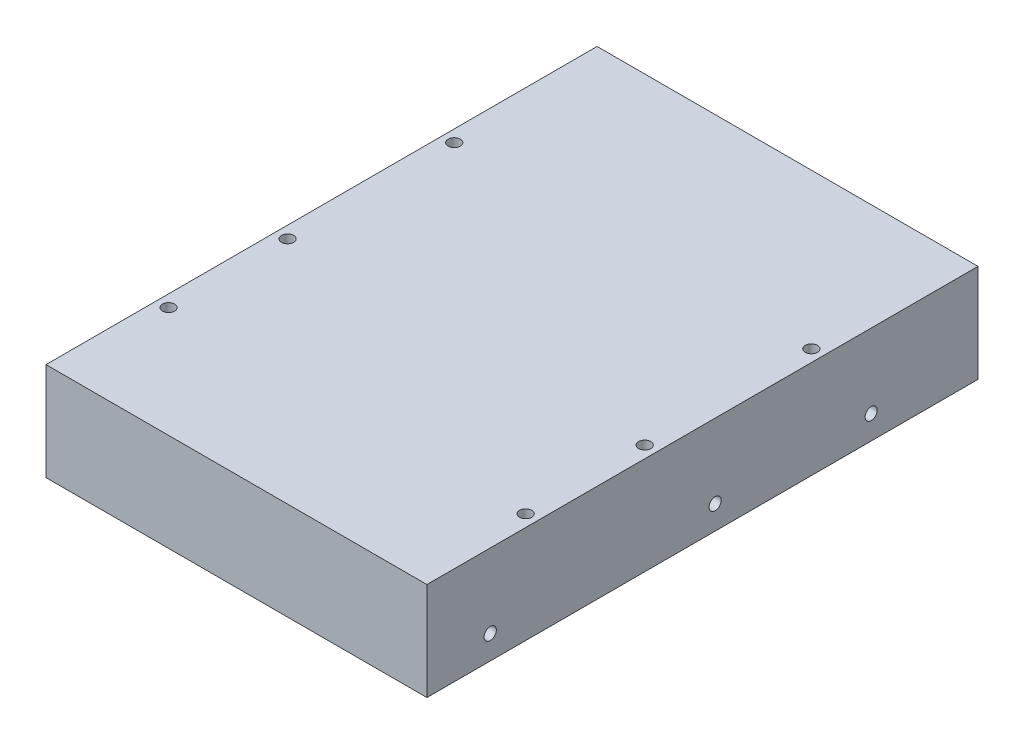
ISO-10303-21;
HEADER;
FILE_DESCRIPTION(('STEP AP214'),'2;1');
FILE_NAME('part.step','',(''),(''),'','','');
FILE_SCHEMA(('AUTOMOTIVE_DESIGN { 1 0 10303 214 1 1 1 1 }'));
ENDSEC;
DATA;
#1=APPLICATION_CONTEXT('core data for automotive mechanical design processes');
#2=APPLICATION_PROTOCOL_DEFINITION('international standard','automotive_design',2000,#1);
#3=PRODUCT_CONTEXT('',#1,'mechanical');
#4=PRODUCT('Part','Part','',(#3));
#5=PRODUCT_RELATED_PRODUCT_CATEGORY('part','',(#4));
#6=PRODUCT_DEFINITION_FORMATION('','',#4);
#7=PRODUCT_DEFINITION_CONTEXT('part definition',#1,'design');
#8=PRODUCT_DEFINITION('design','',#6,#7);
#9=PRODUCT_DEFINITION_SHAPE('','',#8);
#10=(LENGTH_UNIT() NAMED_UNIT(*) SI_UNIT(.MILLI.,.METRE.));
#11=(NAMED_UNIT(*) PLANE_ANGLE_UNIT() SI_UNIT($,.RADIAN.));
#12=(NAMED_UNIT(*) SI_UNIT($,.STERADIAN.) SOLID_ANGLE_UNIT());
#13=UNCERTAINTY_MEASURE_WITH_UNIT(LENGTH_MEASURE(1.E-05),#10,'distance_accuracy_value','');
#14=(GEOMETRIC_REPRESENTATION_CONTEXT(3) GLOBAL_UNCERTAINTY_ASSIGNED_CONTEXT((#13)) GLOBAL_UNIT_ASSIGNED_CONTEXT((#10,
#11,#12)) REPRESENTATION_CONTEXT('',''));
#15=CARTESIAN_POINT('',(0.,0.,0.));
#16=DIRECTION('',(0.,0.,1.));
#17=DIRECTION('',(1.,0.,0.));
#18=AXIS2_PLACEMENT_3D('',#15,#16,#17);
#19=CARTESIAN_POINT('',(0.,-26.1112,0.));
#20=DIRECTION('',(0.,0.,1.));
#21=DIRECTION('',(1.,0.,0.));
#22=AXIS2_PLACEMENT_3D('',#19,#20,#21);
#23=PLANE('',#22);
#24=DIRECTION('',(1.,0.,0.));
#25=VECTOR('',#24,1.);
#26=CARTESIAN_POINT('',(0.,0.,0.));
#27=LINE('',#26,#25);
#28=CARTESIAN_POINT('',(0.,0.,0.));
#29=VERTEX_POINT('',#28);
#30=CARTESIAN_POINT('',(101.6,0.,0.));
#31=VERTEX_POINT('',#30);
#32=EDGE_CURVE('E101',#29,#31,#27,.T.);
#33=ORIENTED_EDGE('',*,*,#32,.F.);
#34=DIRECTION('',(0.,1.,0.));
#35=VECTOR('',#34,1.);
#36=CARTESIAN_POINT('',(0.,-26.1112,0.));
#37=LINE('',#36,#35);
#38=CARTESIAN_POINT('',(0.,-26.1112,0.));
#39=VERTEX_POINT('',#38);
#40=EDGE_CURVE('E11',#39,#29,#37,.T.);
#41=ORIENTED_EDGE('',*,*,#40,.F.);
#42=DIRECTION('',(1.,0.,0.));
#43=VECTOR('',#42,1.);
#44=CARTESIAN_POINT('',(0.,-26.1112,0.));
#45=LINE('',#44,#43);
#46=CARTESIAN_POINT('',(101.6,-26.1112,0.));
#47=VERTEX_POINT('',#46);
#48=EDGE_CURVE('E95',#39,#47,#45,.T.);
#49=ORIENTED_EDGE('',*,*,#48,.T.);
#50=DIRECTION('',(0.,1.,0.));
#51=VECTOR('',#50,1.);
#52=CARTESIAN_POINT('',(101.6,-26.1112,0.));
#53=LINE('',#52,#51);
#54=EDGE_CURVE('E38',#47,#31,#53,.T.);
#55=ORIENTED_EDGE('',*,*,#54,.T.);
#56=EDGE_LOOP('',(#33,#41,#49,#55));
#57=FACE_BOUND('',#56,.T.);
#58=ADVANCED_FACE('F35',(#57),#23,.T.);
#59=CARTESIAN_POINT('',(0.,-26.1112,0.));
#60=DIRECTION('',(1.,0.,0.));
#61=DIRECTION('',(0.,0.,-1.));
#62=AXIS2_PLACEMENT_3D('',#59,#60,#61);
#63=PLANE('',#62);
#64=CARTESIAN_POINT('',(0.,-19.7612,-118.491));
#65=DIRECTION('',(1.,0.,0.));
#66=DIRECTION('',(0.,0.,-1.));
#67=AXIS2_PLACEMENT_3D('',#64,#65,#66);
#68=CIRCLE('',#67,1.62560000000002);
#69=CARTESIAN_POINT('',(0.,-19.7612,-120.1166));
#70=VERTEX_POINT('',#69);
#71=EDGE_CURVE('E307',#70,#70,#68,.T.);
#72=ORIENTED_EDGE('',*,*,#71,.T.);
#73=EDGE_LOOP('',(#72));
#74=FACE_BOUND('',#73,.T.);
#75=CARTESIAN_POINT('',(0.,-19.7612,-76.8858));
#76=DIRECTION('',(1.,0.,0.));
#77=DIRECTION('',(0.,0.,-1.));
#78=AXIS2_PLACEMENT_3D('',#75,#76,#77);
#79=CIRCLE('',#78,1.6256);
#80=CARTESIAN_POINT('',(0.,-19.7612,-78.5114));
#81=VERTEX_POINT('',#80);
#82=EDGE_CURVE('E306',#81,#81,#79,.T.);
#83=ORIENTED_EDGE('',*,*,#82,.T.);
#84=EDGE_LOOP('',(#83));
#85=FACE_BOUND('',#84,.T.);
#86=CARTESIAN_POINT('',(0.,-19.7612,-16.891));
#87=DIRECTION('',(1.,0.,0.));
#88=DIRECTION('',(0.,0.,-1.));
#89=AXIS2_PLACEMENT_3D('',#86,#87,#88);
#90=CIRCLE('',#89,1.6256);
#91=CARTESIAN_POINT('',(0.,-19.7612,-18.5166));
#92=VERTEX_POINT('',#91);
#93=EDGE_CURVE('E315',#92,#92,#90,.T.);
#94=ORIENTED_EDGE('',*,*,#93,.T.);
#95=EDGE_LOOP('',(#94));
#96=FACE_BOUND('',#95,.T.);
#97=DIRECTION('',(0.,0.,-1.));
#98=VECTOR('',#97,1.);
#99=CARTESIAN_POINT('',(0.,0.,0.));
#100=LINE('',#99,#98);
#101=CARTESIAN_POINT('',(0.,0.,-146.9898));
#102=VERTEX_POINT('',#101);
#103=EDGE_CURVE('E68',#29,#102,#100,.T.);
#104=ORIENTED_EDGE('',*,*,#103,.T.);
#105=DIRECTION('',(0.,1.,0.));
#106=VECTOR('',#105,1.);
#107=CARTESIAN_POINT('',(0.,-26.1112,-146.9898));
#108=LINE('',#107,#106);
#109=CARTESIAN_POINT('',(0.,-26.1112,-146.9898));
#110=VERTEX_POINT('',#109);
#111=EDGE_CURVE('E44',#110,#102,#108,.T.);
#112=ORIENTED_EDGE('',*,*,#111,.F.);
#113=DIRECTION('',(0.,0.,-1.));
#114=VECTOR('',#113,1.);
#115=CARTESIAN_POINT('',(0.,-26.1112,0.));
#116=LINE('',#115,#114);
#117=EDGE_CURVE('E85',#39,#110,#116,.T.);
#118=ORIENTED_EDGE('',*,*,#117,.F.);
#119=ORIENTED_EDGE('',*,*,#40,.T.);
#120=EDGE_LOOP('',(#104,#112,#118,#119));
#121=FACE_BOUND('',#120,.T.);
#122=ADVANCED_FACE('F112',(#74,#85,#96,#121),#63,.F.);
#123=CARTESIAN_POINT('',(0.,-26.1112,-146.9898));
#124=DIRECTION('',(0.,0.,1.));
#125=DIRECTION('',(1.,0.,0.));
#126=AXIS2_PLACEMENT_3D('',#123,#124,#125);
#127=PLANE('',#126);
#128=DIRECTION('',(1.,0.,0.));
#129=VECTOR('',#128,1.);
#130=CARTESIAN_POINT('',(0.,0.,-146.9898));
#131=LINE('',#130,#129);
#132=CARTESIAN_POINT('',(101.6,0.,-146.9898));
#133=VERTEX_POINT('',#132);
#134=EDGE_CURVE('E92',#102,#133,#131,.T.);
#135=ORIENTED_EDGE('',*,*,#134,.T.);
#136=DIRECTION('',(0.,1.,0.));
#137=VECTOR('',#136,1.);
#138=CARTESIAN_POINT('',(101.6,-26.1112,-146.9898));
#139=LINE('',#138,#137);
#140=CARTESIAN_POINT('',(101.6,-26.1112,-146.9898));
#141=VERTEX_POINT('',#140);
#142=EDGE_CURVE('E89',#141,#133,#139,.T.);
#143=ORIENTED_EDGE('',*,*,#142,.F.);
#144=DIRECTION('',(1.,0.,0.));
#145=VECTOR('',#144,1.);
#146=CARTESIAN_POINT('',(0.,-26.1112,-146.9898));
#147=LINE('',#146,#145);
#148=EDGE_CURVE('E80',#110,#141,#147,.T.);
#149=ORIENTED_EDGE('',*,*,#148,.F.);
#150=ORIENTED_EDGE('',*,*,#111,.T.);
#151=EDGE_LOOP('',(#135,#143,#149,#150));
#152=FACE_BOUND('',#151,.T.);
#153=ADVANCED_FACE('F90',(#152),#127,.F.);
#154=CARTESIAN_POINT('',(101.6,-26.1112,0.));
#155=DIRECTION('',(1.,0.,0.));
#156=DIRECTION('',(0.,0.,-1.));
#157=AXIS2_PLACEMENT_3D('',#154,#155,#156);
#158=PLANE('',#157);
#159=CARTESIAN_POINT('',(101.6,-19.7612,-118.491));
#160=DIRECTION('',(1.,0.,0.));
#161=DIRECTION('',(0.,0.,-1.));
#162=AXIS2_PLACEMENT_3D('',#159,#160,#161);
#163=CIRCLE('',#162,1.62560000000002);
#164=CARTESIAN_POINT('',(101.6,-19.7612,-120.1166));
#165=VERTEX_POINT('',#164);
#166=EDGE_CURVE('E134',#165,#165,#163,.T.);
#167=ORIENTED_EDGE('',*,*,#166,.F.);
#168=EDGE_LOOP('',(#167));
#169=FACE_BOUND('',#168,.T.);
#170=CARTESIAN_POINT('',(101.6,-19.7612,-76.8858));
#171=DIRECTION('',(1.,0.,0.));
#172=DIRECTION('',(0.,0.,-1.));
#173=AXIS2_PLACEMENT_3D('',#170,#171,#172);
#174=CIRCLE('',#173,1.6256);
#175=CARTESIAN_POINT('',(101.6,-19.7612,-78.5114));
#176=VERTEX_POINT('',#175);
#177=EDGE_CURVE('E138',#176,#176,#174,.T.);
#178=ORIENTED_EDGE('',*,*,#177,.F.);
#179=EDGE_LOOP('',(#178));
#180=FACE_BOUND('',#179,.T.);
#181=CARTESIAN_POINT('',(101.6,-19.7612,-16.891));
#182=DIRECTION('',(1.,0.,0.));
#183=DIRECTION('',(0.,0.,-1.));
#184=AXIS2_PLACEMENT_3D('',#181,#182,#183);
#185=CIRCLE('',#184,1.6256);
#186=CARTESIAN_POINT('',(101.6,-19.7612,-18.5166));
#187=VERTEX_POINT('',#186);
#188=EDGE_CURVE('E141',#187,#187,#185,.T.);
#189=ORIENTED_EDGE('',*,*,#188,.F.);
#190=EDGE_LOOP('',(#189));
#191=FACE_BOUND('',#190,.T.);
#192=DIRECTION('',(0.,0.,-1.));
#193=VECTOR('',#192,1.);
#194=CARTESIAN_POINT('',(101.6,0.,0.));
#195=LINE('',#194,#193);
#196=EDGE_CURVE('E104',#31,#133,#195,.T.);
#197=ORIENTED_EDGE('',*,*,#196,.F.);
#198=ORIENTED_EDGE('',*,*,#54,.F.);
#199=DIRECTION('',(0.,0.,-1.));
#200=VECTOR('',#199,1.);
#201=CARTESIAN_POINT('',(101.6,-26.1112,0.));
#202=LINE('',#201,#200);
#203=EDGE_CURVE('E84',#47,#141,#202,.T.);
#204=ORIENTED_EDGE('',*,*,#203,.T.);
#205=ORIENTED_EDGE('',*,*,#142,.T.);
#206=EDGE_LOOP('',(#197,#198,#204,#205));
#207=FACE_BOUND('',#206,.T.);
#208=ADVANCED_FACE('F94',(#169,#180,#191,#207),#158,.T.);
#209=CARTESIAN_POINT('',(0.,-26.1112,0.));
#210=DIRECTION('',(0.,1.,0.));
#211=DIRECTION('',(0.,0.,1.));
#212=AXIS2_PLACEMENT_3D('',#209,#210,#211);
#213=PLANE('',#212);
#214=ORIENTED_EDGE('',*,*,#48,.F.);
#215=ORIENTED_EDGE('',*,*,#117,.T.);
#216=ORIENTED_EDGE('',*,*,#148,.T.);
#217=ORIENTED_EDGE('',*,*,#203,.F.);
#218=EDGE_LOOP('',(#214,#215,#216,#217));
#219=FACE_BOUND('',#218,.T.);
#220=ADVANCED_FACE('F83',(#219),#213,.F.);
#221=CARTESIAN_POINT('',(0.,0.,0.));
#222=DIRECTION('',(0.,1.,0.));
#223=DIRECTION('',(0.,0.,1.));
#224=AXIS2_PLACEMENT_3D('',#221,#222,#223);
#225=PLANE('',#224);
#226=CARTESIAN_POINT('',(98.425,0.,-29.5148));
#227=DIRECTION('',(0.,1.,0.));
#228=DIRECTION('',(0.,0.,1.));
#229=AXIS2_PLACEMENT_3D('',#226,#227,#228);
#230=CIRCLE('',#229,1.6256);
#231=CARTESIAN_POINT('',(98.425,0.,-27.8892));
#232=VERTEX_POINT('',#231);
#233=EDGE_CURVE('E147',#232,#232,#230,.F.);
#234=ORIENTED_EDGE('',*,*,#233,.T.);
#235=EDGE_LOOP('',(#234));
#236=FACE_BOUND('',#235,.T.);
#237=CARTESIAN_POINT('',(98.425,0.,-61.2648));
#238=DIRECTION('',(0.,1.,0.));
#239=DIRECTION('',(0.,0.,1.));
#240=AXIS2_PLACEMENT_3D('',#237,#238,#239);
#241=CIRCLE('',#240,1.6256);
#242=CARTESIAN_POINT('',(98.425,0.,-59.6392));
#243=VERTEX_POINT('',#242);
#244=EDGE_CURVE('E156',#243,#243,#241,.F.);
#245=ORIENTED_EDGE('',*,*,#244,.T.);
#246=EDGE_LOOP('',(#245));
#247=FACE_BOUND('',#246,.T.);
#248=CARTESIAN_POINT('',(98.425,0.,-105.7148));
#249=DIRECTION('',(0.,1.,0.));
#250=DIRECTION('',(0.,0.,1.));
#251=AXIS2_PLACEMENT_3D('',#248,#249,#250);
#252=CIRCLE('',#251,1.6256);
#253=CARTESIAN_POINT('',(98.425,0.,-104.0892));
#254=VERTEX_POINT('',#253);
#255=EDGE_CURVE('E162',#254,#254,#252,.F.);
#256=ORIENTED_EDGE('',*,*,#255,.T.);
#257=EDGE_LOOP('',(#256));
#258=FACE_BOUND('',#257,.T.);
#259=CARTESIAN_POINT('',(3.17499999999999,0.,-61.2648));
#260=DIRECTION('',(0.,1.,0.));
#261=DIRECTION('',(0.,0.,1.));
#262=AXIS2_PLACEMENT_3D('',#259,#260,#261);
#263=CIRCLE('',#262,1.6256);
#264=CARTESIAN_POINT('',(3.17499999999999,0.,-59.6392));
#265=VERTEX_POINT('',#264);
#266=EDGE_CURVE('E168',#265,#265,#263,.T.);
#267=ORIENTED_EDGE('',*,*,#266,.F.);
#268=EDGE_LOOP('',(#267));
#269=FACE_BOUND('',#268,.T.);
#270=CARTESIAN_POINT('',(3.17499999999999,0.,-29.5148));
#271=DIRECTION('',(0.,1.,0.));
#272=DIRECTION('',(0.,0.,1.));
#273=AXIS2_PLACEMENT_3D('',#270,#271,#272);
#274=CIRCLE('',#273,1.6256);
#275=CARTESIAN_POINT('',(3.17499999999999,0.,-27.8892));
#276=VERTEX_POINT('',#275);
#277=EDGE_CURVE('E174',#276,#276,#274,.T.);
#278=ORIENTED_EDGE('',*,*,#277,.F.);
#279=EDGE_LOOP('',(#278));
#280=FACE_BOUND('',#279,.T.);
#281=CARTESIAN_POINT('',(3.17499999999998,0.,-105.7148));
#282=DIRECTION('',(0.,1.,0.));
#283=DIRECTION('',(0.,0.,1.));
#284=AXIS2_PLACEMENT_3D('',#281,#282,#283);
#285=CIRCLE('',#284,1.6256);
#286=CARTESIAN_POINT('',(3.17499999999998,0.,-104.0892));
#287=VERTEX_POINT('',#286);
#288=EDGE_CURVE('E180',#287,#287,#285,.T.);
#289=ORIENTED_EDGE('',*,*,#288,.F.);
#290=EDGE_LOOP('',(#289));
#291=FACE_BOUND('',#290,.T.);
#292=ORIENTED_EDGE('',*,*,#32,.T.);
#293=ORIENTED_EDGE('',*,*,#196,.T.);
#294=ORIENTED_EDGE('',*,*,#134,.F.);
#295=ORIENTED_EDGE('',*,*,#103,.F.);
#296=EDGE_LOOP('',(#292,#293,#294,#295));
#297=FACE_BOUND('',#296,.T.);
#298=ADVANCED_FACE('F110',(#236,#247,#258,#269,#280,#291,#297),#225,.T.);
#299=CARTESIAN_POINT('',(3.17499999999998,-6.35,-105.7148));
#300=DIRECTION('',(0.,1.,0.));
#301=DIRECTION('',(0.,0.,1.));
#302=AXIS2_PLACEMENT_3D('',#299,#300,#301);
#303=CYLINDRICAL_SURFACE('',#302,1.6256);
#304=CARTESIAN_POINT('',(3.17499999999998,-6.35,-105.7148));
#305=DIRECTION('',(0.,1.,0.));
#306=DIRECTION('',(0.,0.,1.));
#307=AXIS2_PLACEMENT_3D('',#304,#305,#306);
#308=CIRCLE('',#307,1.6256);
#309=CARTESIAN_POINT('',(3.17499999999998,-6.35,-104.0892));
#310=VERTEX_POINT('',#309);
#311=EDGE_CURVE('E105',#310,#310,#308,.T.);
#312=ORIENTED_EDGE('',*,*,#311,.F.);
#313=EDGE_LOOP('',(#312));
#314=FACE_BOUND('',#313,.T.);
#315=ORIENTED_EDGE('',*,*,#288,.T.);
#316=EDGE_LOOP('',(#315));
#317=FACE_BOUND('',#316,.T.);
#318=ADVANCED_FACE('F187',(#314,#317),#303,.F.);
#319=CARTESIAN_POINT('',(0.,-6.35,0.));
#320=DIRECTION('',(0.,1.,0.));
#321=DIRECTION('',(0.,0.,1.));
#322=AXIS2_PLACEMENT_3D('',#319,#320,#321);
#323=PLANE('',#322);
#324=ORIENTED_EDGE('',*,*,#311,.T.);
#325=EDGE_LOOP('',(#324));
#326=FACE_BOUND('',#325,.T.);
#327=ADVANCED_FACE('F194',(#326),#323,.T.);
#328=CARTESIAN_POINT('',(3.17499999999999,-6.35,-29.5148));
#329=DIRECTION('',(0.,1.,0.));
#330=DIRECTION('',(0.,0.,1.));
#331=AXIS2_PLACEMENT_3D('',#328,#329,#330);
#332=CYLINDRICAL_SURFACE('',#331,1.6256);
#333=CARTESIAN_POINT('',(3.17499999999999,-6.35,-29.5148));
#334=DIRECTION('',(0.,1.,0.));
#335=DIRECTION('',(0.,0.,1.));
#336=AXIS2_PLACEMENT_3D('',#333,#334,#335);
#337=CIRCLE('',#336,1.6256);
#338=CARTESIAN_POINT('',(3.17499999999999,-6.35,-27.8892));
#339=VERTEX_POINT('',#338);
#340=EDGE_CURVE('E177',#339,#339,#337,.T.);
#341=ORIENTED_EDGE('',*,*,#340,.F.);
#342=EDGE_LOOP('',(#341));
#343=FACE_BOUND('',#342,.T.);
#344=ORIENTED_EDGE('',*,*,#277,.T.);
#345=EDGE_LOOP('',(#344));
#346=FACE_BOUND('',#345,.T.);
#347=ADVANCED_FACE('F207',(#343,#346),#332,.F.);
#348=CARTESIAN_POINT('',(0.,-6.35,0.));
#349=DIRECTION('',(0.,1.,0.));
#350=DIRECTION('',(0.,0.,1.));
#351=AXIS2_PLACEMENT_3D('',#348,#349,#350);
#352=PLANE('',#351);
#353=ORIENTED_EDGE('',*,*,#340,.T.);
#354=EDGE_LOOP('',(#353));
#355=FACE_BOUND('',#354,.T.);
#356=ADVANCED_FACE('F209',(#355),#352,.T.);
#357=CARTESIAN_POINT('',(3.17499999999999,-6.35,-61.2648));
#358=DIRECTION('',(0.,1.,0.));
#359=DIRECTION('',(0.,0.,1.));
#360=AXIS2_PLACEMENT_3D('',#357,#358,#359);
#361=CYLINDRICAL_SURFACE('',#360,1.6256);
#362=CARTESIAN_POINT('',(3.17499999999999,-6.35,-61.2648));
#363=DIRECTION('',(0.,1.,0.));
#364=DIRECTION('',(0.,0.,1.));
#365=AXIS2_PLACEMENT_3D('',#362,#363,#364);
#366=CIRCLE('',#365,1.6256);
#367=CARTESIAN_POINT('',(3.17499999999999,-6.35,-59.6392));
#368=VERTEX_POINT('',#367);
#369=EDGE_CURVE('E171',#368,#368,#366,.T.);
#370=ORIENTED_EDGE('',*,*,#369,.F.);
#371=EDGE_LOOP('',(#370));
#372=FACE_BOUND('',#371,.T.);
#373=ORIENTED_EDGE('',*,*,#266,.T.);
#374=EDGE_LOOP('',(#373));
#375=FACE_BOUND('',#374,.T.);
#376=ADVANCED_FACE('F216',(#372,#375),#361,.F.);
#377=CARTESIAN_POINT('',(0.,-6.35,0.));
#378=DIRECTION('',(0.,1.,0.));
#379=DIRECTION('',(0.,0.,1.));
#380=AXIS2_PLACEMENT_3D('',#377,#378,#379);
#381=PLANE('',#380);
#382=ORIENTED_EDGE('',*,*,#369,.T.);
#383=EDGE_LOOP('',(#382));
#384=FACE_BOUND('',#383,.T.);
#385=ADVANCED_FACE('F225',(#384),#381,.T.);
#386=CARTESIAN_POINT('',(98.425,-6.35,-105.7148));
#387=DIRECTION('',(0.,1.,0.));
#388=DIRECTION('',(0.,0.,1.));
#389=AXIS2_PLACEMENT_3D('',#386,#387,#388);
#390=CYLINDRICAL_SURFACE('',#389,1.6256);
#391=CARTESIAN_POINT('',(98.425,-6.35,-105.7148));
#392=DIRECTION('',(0.,1.,0.));
#393=DIRECTION('',(0.,0.,1.));
#394=AXIS2_PLACEMENT_3D('',#391,#392,#393);
#395=CIRCLE('',#394,1.6256);
#396=CARTESIAN_POINT('',(98.425,-6.35,-104.0892));
#397=VERTEX_POINT('',#396);
#398=EDGE_CURVE('E165',#397,#397,#395,.F.);
#399=ORIENTED_EDGE('',*,*,#398,.T.);
#400=EDGE_LOOP('',(#399));
#401=FACE_BOUND('',#400,.T.);
#402=ORIENTED_EDGE('',*,*,#255,.F.);
#403=EDGE_LOOP('',(#402));
#404=FACE_BOUND('',#403,.T.);
#405=ADVANCED_FACE('F229',(#401,#404),#390,.F.);
#406=CARTESIAN_POINT('',(0.,-6.35,0.));
#407=DIRECTION('',(0.,1.,0.));
#408=DIRECTION('',(0.,0.,1.));
#409=AXIS2_PLACEMENT_3D('',#406,#407,#408);
#410=PLANE('',#409);
#411=ORIENTED_EDGE('',*,*,#398,.F.);
#412=EDGE_LOOP('',(#411));
#413=FACE_BOUND('',#412,.T.);
#414=ADVANCED_FACE('F233',(#413),#410,.T.);
#415=CARTESIAN_POINT('',(98.425,-6.35,-61.2648));
#416=DIRECTION('',(0.,1.,0.));
#417=DIRECTION('',(0.,0.,1.));
#418=AXIS2_PLACEMENT_3D('',#415,#416,#417);
#419=CYLINDRICAL_SURFACE('',#418,1.6256);
#420=CARTESIAN_POINT('',(98.425,-6.35,-61.2648));
#421=DIRECTION('',(0.,1.,0.));
#422=DIRECTION('',(0.,0.,1.));
#423=AXIS2_PLACEMENT_3D('',#420,#421,#422);
#424=CIRCLE('',#423,1.6256);
#425=CARTESIAN_POINT('',(98.425,-6.35,-59.6392));
#426=VERTEX_POINT('',#425);
#427=EDGE_CURVE('E159',#426,#426,#424,.F.);
#428=ORIENTED_EDGE('',*,*,#427,.T.);
#429=EDGE_LOOP('',(#428));
#430=FACE_BOUND('',#429,.T.);
#431=ORIENTED_EDGE('',*,*,#244,.F.);
#432=EDGE_LOOP('',(#431));
#433=FACE_BOUND('',#432,.T.);
#434=ADVANCED_FACE('F237',(#430,#433),#419,.F.);
#435=CARTESIAN_POINT('',(0.,-6.35,0.));
#436=DIRECTION('',(0.,1.,0.));
#437=DIRECTION('',(0.,0.,1.));
#438=AXIS2_PLACEMENT_3D('',#435,#436,#437);
#439=PLANE('',#438);
#440=ORIENTED_EDGE('',*,*,#427,.F.);
#441=EDGE_LOOP('',(#440));
#442=FACE_BOUND('',#441,.T.);
#443=ADVANCED_FACE('F241',(#442),#439,.T.);
#444=CARTESIAN_POINT('',(98.425,-6.35,-29.5148));
#445=DIRECTION('',(0.,1.,0.));
#446=DIRECTION('',(0.,0.,1.));
#447=AXIS2_PLACEMENT_3D('',#444,#445,#446);
#448=CYLINDRICAL_SURFACE('',#447,1.6256);
#449=CARTESIAN_POINT('',(98.425,-6.35,-29.5148));
#450=DIRECTION('',(0.,1.,0.));
#451=DIRECTION('',(0.,0.,1.));
#452=AXIS2_PLACEMENT_3D('',#449,#450,#451);
#453=CIRCLE('',#452,1.6256);
#454=CARTESIAN_POINT('',(98.425,-6.35,-27.8892));
#455=VERTEX_POINT('',#454);
#456=EDGE_CURVE('E153',#455,#455,#453,.F.);
#457=ORIENTED_EDGE('',*,*,#456,.T.);
#458=EDGE_LOOP('',(#457));
#459=FACE_BOUND('',#458,.T.);
#460=ORIENTED_EDGE('',*,*,#233,.F.);
#461=EDGE_LOOP('',(#460));
#462=FACE_BOUND('',#461,.T.);
#463=ADVANCED_FACE('F245',(#459,#462),#448,.F.);
#464=CARTESIAN_POINT('',(0.,-6.35,0.));
#465=DIRECTION('',(0.,1.,0.));
#466=DIRECTION('',(0.,0.,1.));
#467=AXIS2_PLACEMENT_3D('',#464,#465,#466);
#468=PLANE('',#467);
#469=ORIENTED_EDGE('',*,*,#456,.F.);
#470=EDGE_LOOP('',(#469));
#471=FACE_BOUND('',#470,.T.);
#472=ADVANCED_FACE('F249',(#471),#468,.T.);
#473=CARTESIAN_POINT('',(96.8248,-19.7612,-16.891));
#474=DIRECTION('',(1.,0.,0.));
#475=DIRECTION('',(0.,0.,-1.));
#476=AXIS2_PLACEMENT_3D('',#473,#474,#475);
#477=CYLINDRICAL_SURFACE('',#476,1.6256);
#478=CARTESIAN_POINT('',(96.8248,-19.7612,-16.891));
#479=DIRECTION('',(1.,0.,0.));
#480=DIRECTION('',(0.,0.,-1.));
#481=AXIS2_PLACEMENT_3D('',#478,#479,#480);
#482=CIRCLE('',#481,1.6256);
#483=CARTESIAN_POINT('',(96.8248,-19.7612,-18.5166));
#484=VERTEX_POINT('',#483);
#485=EDGE_CURVE('E143',#484,#484,#482,.T.);
#486=ORIENTED_EDGE('',*,*,#485,.F.);
#487=EDGE_LOOP('',(#486));
#488=FACE_BOUND('',#487,.T.);
#489=ORIENTED_EDGE('',*,*,#188,.T.);
#490=EDGE_LOOP('',(#489));
#491=FACE_BOUND('',#490,.T.);
#492=ADVANCED_FACE('F253',(#488,#491),#477,.F.);
#493=CARTESIAN_POINT('',(96.8248,-19.7612,-16.891));
#494=DIRECTION('',(1.,0.,0.));
#495=DIRECTION('',(0.,0.,-1.));
#496=AXIS2_PLACEMENT_3D('',#493,#494,#495);
#497=PLANE('',#496);
#498=ORIENTED_EDGE('',*,*,#485,.T.);
#499=EDGE_LOOP('',(#498));
#500=FACE_BOUND('',#499,.T.);
#501=ADVANCED_FACE('F257',(#500),#497,.T.);
#502=CARTESIAN_POINT('',(96.8248,-19.7612,-76.8858));
#503=DIRECTION('',(1.,0.,0.));
#504=DIRECTION('',(0.,0.,-1.));
#505=AXIS2_PLACEMENT_3D('',#502,#503,#504);
#506=CYLINDRICAL_SURFACE('',#505,1.6256);
#507=CARTESIAN_POINT('',(96.8248,-19.7612,-76.8858));
#508=DIRECTION('',(1.,0.,0.));
#509=DIRECTION('',(0.,0.,-1.));
#510=AXIS2_PLACEMENT_3D('',#507,#508,#509);
#511=CIRCLE('',#510,1.6256);
#512=CARTESIAN_POINT('',(96.8248,-19.7612,-78.5114));
#513=VERTEX_POINT('',#512);
#514=EDGE_CURVE('E144',#513,#513,#511,.T.);
#515=ORIENTED_EDGE('',*,*,#514,.F.);
#516=EDGE_LOOP('',(#515));
#517=FACE_BOUND('',#516,.T.);
#518=ORIENTED_EDGE('',*,*,#177,.T.);
#519=EDGE_LOOP('',(#518));
#520=FACE_BOUND('',#519,.T.);
#521=ADVANCED_FACE('F261',(#517,#520),#506,.F.);
#522=CARTESIAN_POINT('',(96.8248,-19.7612,-76.8858));
#523=DIRECTION('',(1.,0.,0.));
#524=DIRECTION('',(0.,0.,-1.));
#525=AXIS2_PLACEMENT_3D('',#522,#523,#524);
#526=PLANE('',#525);
#527=ORIENTED_EDGE('',*,*,#514,.T.);
#528=EDGE_LOOP('',(#527));
#529=FACE_BOUND('',#528,.T.);
#530=ADVANCED_FACE('F265',(#529),#526,.T.);
#531=CARTESIAN_POINT('',(96.8248,-19.7612,-118.491));
#532=DIRECTION('',(1.,0.,0.));
#533=DIRECTION('',(0.,0.,-1.));
#534=AXIS2_PLACEMENT_3D('',#531,#532,#533);
#535=CYLINDRICAL_SURFACE('',#534,1.62560000000002);
#536=CARTESIAN_POINT('',(96.8248,-19.7612,-118.491));
#537=DIRECTION('',(1.,0.,0.));
#538=DIRECTION('',(0.,0.,-1.));
#539=AXIS2_PLACEMENT_3D('',#536,#537,#538);
#540=CIRCLE('',#539,1.62560000000002);
#541=CARTESIAN_POINT('',(96.8248,-19.7612,-120.1166));
#542=VERTEX_POINT('',#541);
#543=EDGE_CURVE('E322',#542,#542,#540,.T.);
#544=ORIENTED_EDGE('',*,*,#543,.F.);
#545=EDGE_LOOP('',(#544));
#546=FACE_BOUND('',#545,.T.);
#547=ORIENTED_EDGE('',*,*,#166,.T.);
#548=EDGE_LOOP('',(#547));
#549=FACE_BOUND('',#548,.T.);
#550=ADVANCED_FACE('F269',(#546,#549),#535,.F.);
#551=CARTESIAN_POINT('',(96.8248,-19.7612,-118.491));
#552=DIRECTION('',(1.,0.,0.));
#553=DIRECTION('',(0.,0.,-1.));
#554=AXIS2_PLACEMENT_3D('',#551,#552,#553);
#555=PLANE('',#554);
#556=ORIENTED_EDGE('',*,*,#543,.T.);
#557=EDGE_LOOP('',(#556));
#558=FACE_BOUND('',#557,.T.);
#559=ADVANCED_FACE('F273',(#558),#555,.T.);
#560=CARTESIAN_POINT('',(4.7752,-19.7612,-16.891));
#561=DIRECTION('',(-1.,0.,0.));
#562=DIRECTION('',(0.,0.,1.));
#563=AXIS2_PLACEMENT_3D('',#560,#561,#562);
#564=CYLINDRICAL_SURFACE('',#563,1.6256);
#565=CARTESIAN_POINT('',(4.7752,-19.7612,-16.891));
#566=DIRECTION('',(1.,0.,0.));
#567=DIRECTION('',(0.,0.,-1.));
#568=AXIS2_PLACEMENT_3D('',#565,#566,#567);
#569=CIRCLE('',#568,1.6256);
#570=CARTESIAN_POINT('',(4.7752,-19.7612,-18.5166));
#571=VERTEX_POINT('',#570);
#572=EDGE_CURVE('E317',#571,#571,#569,.T.);
#573=ORIENTED_EDGE('',*,*,#572,.T.);
#574=EDGE_LOOP('',(#573));
#575=FACE_BOUND('',#574,.T.);
#576=ORIENTED_EDGE('',*,*,#93,.F.);
#577=EDGE_LOOP('',(#576));
#578=FACE_BOUND('',#577,.T.);
#579=ADVANCED_FACE('F277',(#575,#578),#564,.F.);
#580=CARTESIAN_POINT('',(4.7752,-19.7612,-16.891));
#581=DIRECTION('',(-1.,0.,0.));
#582=DIRECTION('',(0.,0.,-1.));
#583=AXIS2_PLACEMENT_3D('',#580,#581,#582);
#584=PLANE('',#583);
#585=ORIENTED_EDGE('',*,*,#572,.F.);
#586=EDGE_LOOP('',(#585));
#587=FACE_BOUND('',#586,.T.);
#588=ADVANCED_FACE('F281',(#587),#584,.T.);
#589=CARTESIAN_POINT('',(4.7752,-19.7612,-76.8858));
#590=DIRECTION('',(-1.,0.,0.));
#591=DIRECTION('',(0.,0.,1.));
#592=AXIS2_PLACEMENT_3D('',#589,#590,#591);
#593=CYLINDRICAL_SURFACE('',#592,1.6256);
#594=CARTESIAN_POINT('',(4.7752,-19.7612,-76.8858));
#595=DIRECTION('',(1.,0.,0.));
#596=DIRECTION('',(0.,0.,-1.));
#597=AXIS2_PLACEMENT_3D('',#594,#595,#596);
#598=CIRCLE('',#597,1.6256);
#599=CARTESIAN_POINT('',(4.7752,-19.7612,-78.5114));
#600=VERTEX_POINT('',#599);
#601=EDGE_CURVE('E310',#600,#600,#598,.T.);
#602=ORIENTED_EDGE('',*,*,#601,.T.);
#603=EDGE_LOOP('',(#602));
#604=FACE_BOUND('',#603,.T.);
#605=ORIENTED_EDGE('',*,*,#82,.F.);
#606=EDGE_LOOP('',(#605));
#607=FACE_BOUND('',#606,.T.);
#608=ADVANCED_FACE('F285',(#604,#607),#593,.F.);
#609=CARTESIAN_POINT('',(4.7752,-19.7612,-76.8858));
#610=DIRECTION('',(-1.,0.,0.));
#611=DIRECTION('',(0.,0.,-1.));
#612=AXIS2_PLACEMENT_3D('',#609,#610,#611);
#613=PLANE('',#612);
#614=ORIENTED_EDGE('',*,*,#601,.F.);
#615=EDGE_LOOP('',(#614));
#616=FACE_BOUND('',#615,.T.);
#617=ADVANCED_FACE('F289',(#616),#613,.T.);
#618=CARTESIAN_POINT('',(4.7752,-19.7612,-118.491));
#619=DIRECTION('',(-1.,0.,0.));
#620=DIRECTION('',(0.,0.,1.));
#621=AXIS2_PLACEMENT_3D('',#618,#619,#620);
#622=CYLINDRICAL_SURFACE('',#621,1.62560000000002);
#623=CARTESIAN_POINT('',(4.7752,-19.7612,-118.491));
#624=DIRECTION('',(1.,0.,0.));
#625=DIRECTION('',(0.,0.,-1.));
#626=AXIS2_PLACEMENT_3D('',#623,#624,#625);
#627=CIRCLE('',#626,1.62560000000002);
#628=CARTESIAN_POINT('',(4.7752,-19.7612,-120.1166));
#629=VERTEX_POINT('',#628);
#630=EDGE_CURVE('E305',#629,#629,#627,.T.);
#631=ORIENTED_EDGE('',*,*,#630,.T.);
#632=EDGE_LOOP('',(#631));
#633=FACE_BOUND('',#632,.T.);
#634=ORIENTED_EDGE('',*,*,#71,.F.);
#635=EDGE_LOOP('',(#634));
#636=FACE_BOUND('',#635,.T.);
#637=ADVANCED_FACE('F293',(#633,#636),#622,.F.);
#638=CARTESIAN_POINT('',(4.7752,-19.7612,-118.491));
#639=DIRECTION('',(-1.,0.,0.));
#640=DIRECTION('',(0.,0.,-1.));
#641=AXIS2_PLACEMENT_3D('',#638,#639,#640);
#642=PLANE('',#641);
#643=ORIENTED_EDGE('',*,*,#630,.F.);
#644=EDGE_LOOP('',(#643));
#645=FACE_BOUND('',#644,.T.);
#646=ADVANCED_FACE('F297',(#645),#642,.T.);
#647=CLOSED_SHELL('',(#58,#122,#153,#208,#220,#298,#318,#327,#347,#356,#376,#385,#405,#414,#434,
#443,#463,#472,#492,#501,#521,#530,#550,#559,#579,#588,#608,#617,#637,#646));
#648=MANIFOLD_SOLID_BREP('B2',#647);
#649=ADVANCED_BREP_SHAPE_REPRESENTATION('',(#18,#648),#14);
#650=SHAPE_DEFINITION_REPRESENTATION(#9,#649);
ENDSEC;
END-ISO-10303-21;
